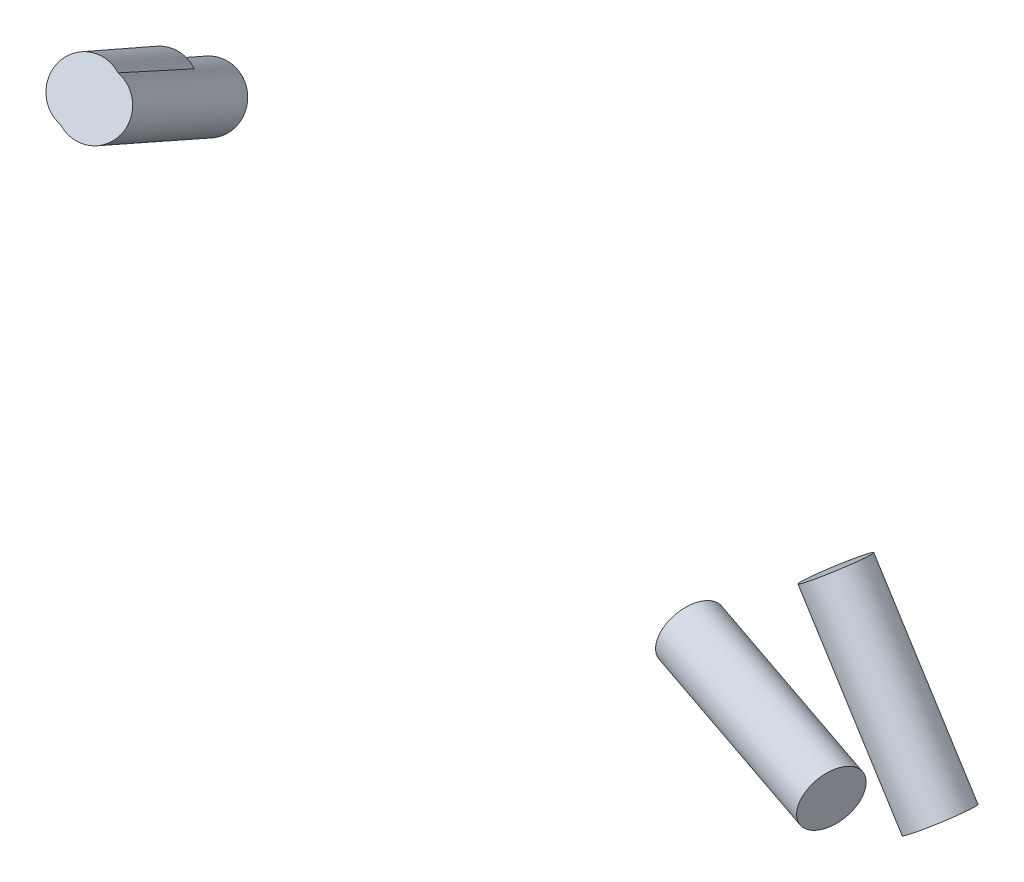
ISO-10303-21;
HEADER;
FILE_DESCRIPTION(('STEP AP214'),'2;1');
FILE_NAME('part.step','',(''),(''),'','','');
FILE_SCHEMA(('AUTOMOTIVE_DESIGN { 1 0 10303 214 1 1 1 1 }'));
ENDSEC;
DATA;
#1=APPLICATION_CONTEXT('core data for automotive mechanical design processes');
#2=APPLICATION_PROTOCOL_DEFINITION('international standard','automotive_design',2000,#1);
#3=PRODUCT_CONTEXT('',#1,'mechanical');
#4=PRODUCT('Part','Part','',(#3));
#5=PRODUCT_RELATED_PRODUCT_CATEGORY('part','',(#4));
#6=PRODUCT_DEFINITION_FORMATION('','',#4);
#7=PRODUCT_DEFINITION_CONTEXT('part definition',#1,'design');
#8=PRODUCT_DEFINITION('design','',#6,#7);
#9=PRODUCT_DEFINITION_SHAPE('','',#8);
#10=(LENGTH_UNIT() NAMED_UNIT(*) SI_UNIT(.MILLI.,.METRE.));
#11=(NAMED_UNIT(*) PLANE_ANGLE_UNIT() SI_UNIT($,.RADIAN.));
#12=(NAMED_UNIT(*) SI_UNIT($,.STERADIAN.) SOLID_ANGLE_UNIT());
#13=UNCERTAINTY_MEASURE_WITH_UNIT(LENGTH_MEASURE(1.E-05),#10,'distance_accuracy_value','');
#14=(GEOMETRIC_REPRESENTATION_CONTEXT(3) GLOBAL_UNCERTAINTY_ASSIGNED_CONTEXT((#13)) GLOBAL_UNIT_ASSIGNED_CONTEXT((#10,
#11,#12)) REPRESENTATION_CONTEXT('',''));
#15=CARTESIAN_POINT('',(0.,0.,0.));
#16=DIRECTION('',(0.,0.,1.));
#17=DIRECTION('',(1.,0.,0.));
#18=AXIS2_PLACEMENT_3D('',#15,#16,#17);
#19=CARTESIAN_POINT('',(90.2859184,-173.45527,-42.383));
#20=DIRECTION('',(-0.305548311077003,-0.520157791657343,-0.79754379276385));
#21=DIRECTION('',(0.,0.837600728553223,-0.546282911619163));
#22=AXIS2_PLACEMENT_3D('',#19,#20,#21);
#23=PLANE('',#22);
#24=CARTESIAN_POINT('',(90.2859184,-173.45527,-42.383));
#25=DIRECTION('',(-0.305548311077003,-0.520157791657343,-0.79754379276385));
#26=DIRECTION('',(0.,0.837600728553223,-0.546282911619163));
#27=AXIS2_PLACEMENT_3D('',#24,#25,#26);
#28=CIRCLE('',#27,7.00000000000001);
#29=CARTESIAN_POINT('',(88.6836040348085,-178.865647569836,-38.2404882948965));
#30=VERTEX_POINT('',#29);
#31=CARTESIAN_POINT('',(94.2313609407783,-169.421279764102,-46.5255120318586));
#32=VERTEX_POINT('',#31);
#33=EDGE_CURVE('E106',#30,#32,#28,.T.);
#34=ORIENTED_EDGE('',*,*,#33,.F.);
#35=CARTESIAN_POINT('',(92.6291910740161,-174.831742214472,-42.3830003267297));
#36=DIRECTION('',(-0.305548311077003,-0.520157791657343,-0.79754379276385));
#37=DIRECTION('',(-0.403946285206619,-0.687679794713225,0.603261053451115));
#38=AXIS2_PLACEMENT_3D('',#35,#36,#37);
#39=ELLIPSE('',#38,7.00003380497109,7.);
#40=EDGE_CURVE('E117',#30,#32,#39,.F.);
#41=ORIENTED_EDGE('',*,*,#40,.T.);
#42=EDGE_LOOP('',(#34,#41));
#43=FACE_BOUND('',#42,.T.);
#44=ADVANCED_FACE('F76',(#43),#23,.F.);
#45=CARTESIAN_POINT('',(79.0072944,-192.655717,-71.8225231));
#46=DIRECTION('',(-0.305548311077003,-0.520157791657343,-0.79754379276385));
#47=DIRECTION('',(0.,0.837600728553223,-0.546282911619163));
#48=AXIS2_PLACEMENT_3D('',#45,#46,#47);
#49=PLANE('',#48);
#50=CARTESIAN_POINT('',(81.3042270092609,-194.111078728709,-71.7533182940053));
#51=DIRECTION('',(-0.305548311077003,-0.520157791657343,-0.79754379276385));
#52=DIRECTION('',(-0.403946285206619,-0.687679794713225,0.603261053451115));
#53=AXIS2_PLACEMENT_3D('',#50,#51,#52);
#54=ELLIPSE('',#53,7.00003380497109,7.);
#55=CARTESIAN_POINT('',(77.1346731846192,-197.954491287071,-67.6492413172329));
#56=VERTEX_POINT('',#55);
#57=CARTESIAN_POINT('',(83.1767073308547,-188.812214646942,-75.9266046627928));
#58=VERTEX_POINT('',#57);
#59=EDGE_CURVE('E101',#56,#58,#54,.T.);
#60=ORIENTED_EDGE('',*,*,#59,.F.);
#61=CARTESIAN_POINT('',(79.0072944,-192.655717,-71.8225231));
#62=DIRECTION('',(-0.305548311077003,-0.520157791657343,-0.79754379276385));
#63=DIRECTION('',(0.,0.837600728553223,-0.546282911619163));
#64=AXIS2_PLACEMENT_3D('',#61,#62,#63);
#65=CIRCLE('',#64,7.00000000000001);
#66=EDGE_CURVE('E112',#56,#58,#65,.T.);
#67=ORIENTED_EDGE('',*,*,#66,.T.);
#68=EDGE_LOOP('',(#60,#67));
#69=FACE_BOUND('',#68,.T.);
#70=ADVANCED_FACE('F139',(#69),#49,.T.);
#71=CARTESIAN_POINT('',(90.2859184,-173.45527,-42.383));
#72=DIRECTION('',(-0.305548311077002,-0.520157791657342,-0.797543792763851));
#73=DIRECTION('',(0.,0.837600728553224,-0.546282911619162));
#74=AXIS2_PLACEMENT_3D('',#71,#72,#73);
#75=CYLINDRICAL_SURFACE('',#74,7.00000000000001);
#76=CARTESIAN_POINT('',(88.6836040348085,-178.865647569836,-38.2404882948965));
#77=CARTESIAN_POINT('',(87.2232316523993,-181.279398953401,-41.9578656735616));
#78=CARTESIAN_POINT('',(85.7629826047996,-183.692940530601,-45.6754277504005));
#79=CARTESIAN_POINT('',(81.9156006365208,-190.052062476592,-55.4716446048369));
#80=CARTESIAN_POINT('',(79.5286943233058,-193.99730544748,-61.5506074075355));
#81=CARTESIAN_POINT('',(77.1396930186936,-197.946193775641,-67.6364535677545));
#82=CARTESIAN_POINT('',(77.1371831014269,-197.950342531635,-67.642847442223));
#83=CARTESIAN_POINT('',(77.1346731846192,-197.954491287071,-67.6492413172329));
#84=B_SPLINE_CURVE_WITH_KNOTS('',3,(#76,#77,#78,#79,#80,#81,#82,#83),.UNSPECIFIED.,.F.,.F.,(4,2,
2,4),(0.,14.0000000298617,36.8898332261833,36.9139068928192),.UNSPECIFIED.);
#85=EDGE_CURVE('E13',#30,#56,#84,.T.);
#86=ORIENTED_EDGE('',*,*,#85,.F.);
#87=ORIENTED_EDGE('',*,*,#33,.T.);
#88=CARTESIAN_POINT('',(83.1767073308547,-188.812214646942,-75.9266046627928));
#89=CARTESIAN_POINT('',(84.5746206935149,-186.360292388074,-72.2101960093443));
#90=CARTESIAN_POINT('',(85.9723784962436,-183.908558923566,-68.4936042689251));
#91=CARTESIAN_POINT('',(89.6550583175193,-177.448820018056,-58.699993105567));
#92=CARTESIAN_POINT('',(91.939740660349,-173.4411436228,-52.6226665151017));
#93=CARTESIAN_POINT('',(94.2265162375328,-169.429778138715,-46.5384020009878));
#94=CARTESIAN_POINT('',(94.2289385893405,-169.425528951093,-46.5319570167003));
#95=CARTESIAN_POINT('',(94.2313609407783,-169.421279764102,-46.5255120318586));
#96=B_SPLINE_CURVE_WITH_KNOTS('',3,(#88,#89,#90,#91,#92,#93,#94,#95),.UNSPECIFIED.,.F.,.F.,(4,2,
2,4),(0.,14.000000029866,36.8896542032104,36.9139266331611),.UNSPECIFIED.);
#97=EDGE_CURVE('E89',#58,#32,#96,.T.);
#98=ORIENTED_EDGE('',*,*,#97,.F.);
#99=ORIENTED_EDGE('',*,*,#66,.F.);
#100=EDGE_LOOP('',(#86,#87,#98,#99));
#101=FACE_BOUND('',#100,.T.);
#102=ADVANCED_FACE('F108',(#101),#75,.T.);
#103=CARTESIAN_POINT('',(75.2253056000002,-204.459683,-87.5184769000008));
#104=DIRECTION('',(-0.30680222447323,-0.522292458953053,-0.79566511949378));
#105=DIRECTION('',(0.,0.835981770105138,-0.548757214122858));
#106=AXIS2_PLACEMENT_3D('',#103,#104,#105);
#107=PLANE('',#106);
#108=CARTESIAN_POINT('',(75.2253056000002,-204.459683,-87.5184769000008));
#109=DIRECTION('',(-0.30680222447323,-0.522292458953053,-0.79566511949378));
#110=DIRECTION('',(0.,0.835981770105138,-0.548757214122858));
#111=AXIS2_PLACEMENT_3D('',#108,#109,#110);
#112=CIRCLE('',#111,7.);
#113=CARTESIAN_POINT('',(75.2253056000002,-198.607810609264,-91.3597773988608));
#114=VERTEX_POINT('',#113);
#115=EDGE_CURVE('E118',#114,#114,#112,.T.);
#116=ORIENTED_EDGE('',*,*,#115,.T.);
#117=EDGE_LOOP('',(#116));
#118=FACE_BOUND('',#117,.T.);
#119=ADVANCED_FACE('F132',(#118),#107,.T.);
#120=CARTESIAN_POINT('',(94.1965818150663,-172.163455288949,-38.3181075658888));
#121=DIRECTION('',(-0.30680222447323,-0.522292458953052,-0.795665119493781));
#122=DIRECTION('',(0.,0.835981770105138,-0.548757214122858));
#123=AXIS2_PLACEMENT_3D('',#120,#121,#122);
#124=CYLINDRICAL_SURFACE('',#123,7.);
#125=ORIENTED_EDGE('',*,*,#40,.F.);
#126=ORIENTED_EDGE('',*,*,#85,.T.);
#127=ORIENTED_EDGE('',*,*,#59,.T.);
#128=ORIENTED_EDGE('',*,*,#97,.T.);
#129=EDGE_LOOP('',(#125,#126,#127,#128));
#130=FACE_BOUND('',#129,.T.);
#131=ORIENTED_EDGE('',*,*,#115,.F.);
#132=EDGE_LOOP('',(#131));
#133=FACE_BOUND('',#132,.T.);
#134=ADVANCED_FACE('F115',(#130,#133),#124,.T.);
#135=CLOSED_SHELL('',(#44,#70,#102,#119,#134));
#136=MANIFOLD_SOLID_BREP('B2',#135);
#137=CARTESIAN_POINT('',(217.671213,-235.931172,-96.1393535));
#138=DIRECTION('',(0.612437587886598,-0.787189398401177,0.0724779413921193));
#139=DIRECTION('',(0.789265153444726,0.614052536480286,0.));
#140=AXIS2_PLACEMENT_3D('',#137,#138,#139);
#141=PLANE('',#140);
#142=CARTESIAN_POINT('',(217.671213,-235.931172,-96.1393535));
#143=DIRECTION('',(0.612437587886598,-0.787189398401177,0.0724779413921193));
#144=DIRECTION('',(0.789265153444726,0.614052536480286,0.));
#145=AXIS2_PLACEMENT_3D('',#142,#143,#144);
#146=CIRCLE('',#145,7.);
#147=CARTESIAN_POINT('',(223.196069074113,-231.632804244638,-96.1393535));
#148=VERTEX_POINT('',#147);
#149=EDGE_CURVE('E211',#148,#148,#146,.T.);
#150=ORIENTED_EDGE('',*,*,#149,.F.);
#151=EDGE_LOOP('',(#150));
#152=FACE_BOUND('',#151,.T.);
#153=ADVANCED_FACE('F205',(#152),#141,.F.);
#154=CARTESIAN_POINT('',(246.179812,-272.574362,-92.7655492));
#155=DIRECTION('',(0.612437587886598,-0.787189398401177,0.0724779413921193));
#156=DIRECTION('',(0.789265153444726,0.614052536480286,0.));
#157=AXIS2_PLACEMENT_3D('',#154,#155,#156);
#158=PLANE('',#157);
#159=CARTESIAN_POINT('',(246.179812,-272.574362,-92.7655492));
#160=DIRECTION('',(0.612437587886598,-0.787189398401177,0.0724779413921193));
#161=DIRECTION('',(0.789265153444726,0.614052536480286,0.));
#162=AXIS2_PLACEMENT_3D('',#159,#160,#161);
#163=CIRCLE('',#162,7.);
#164=CARTESIAN_POINT('',(251.704668074113,-268.275994244638,-92.7655492));
#165=VERTEX_POINT('',#164);
#166=EDGE_CURVE('E75',#165,#165,#163,.T.);
#167=ORIENTED_EDGE('',*,*,#166,.T.);
#168=EDGE_LOOP('',(#167));
#169=FACE_BOUND('',#168,.T.);
#170=ADVANCED_FACE('F220',(#169),#158,.T.);
#171=CARTESIAN_POINT('',(217.671213,-235.931172,-96.1393535));
#172=DIRECTION('',(0.612437587886599,-0.787189398401176,0.0724779413921193));
#173=DIRECTION('',(0.789265153444725,0.614052536480288,0.));
#174=AXIS2_PLACEMENT_3D('',#171,#172,#173);
#175=CYLINDRICAL_SURFACE('',#174,7.);
#176=ORIENTED_EDGE('',*,*,#166,.F.);
#177=EDGE_LOOP('',(#176));
#178=FACE_BOUND('',#177,.T.);
#179=ORIENTED_EDGE('',*,*,#149,.T.);
#180=EDGE_LOOP('',(#179));
#181=FACE_BOUND('',#180,.T.);
#182=ADVANCED_FACE('F217',(#178,#181),#175,.T.);
#183=CLOSED_SHELL('',(#153,#170,#182));
#184=MANIFOLD_SOLID_BREP('B7',#183);
#185=CARTESIAN_POINT('',(210.980497,-238.523155,-67.7546604));
#186=DIRECTION('',(0.961206895835901,-0.178515476938392,0.210270130762719));
#187=DIRECTION('',(0.213702816900093,0.,-0.976898718419144));
#188=AXIS2_PLACEMENT_3D('',#185,#186,#187);
#189=PLANE('',#188);
#190=CARTESIAN_POINT('',(210.980497,-238.523155,-67.7546604));
#191=DIRECTION('',(0.961206895835901,-0.178515476938392,0.210270130762719));
#192=DIRECTION('',(0.213702816900093,0.,-0.976898718419144));
#193=AXIS2_PLACEMENT_3D('',#190,#191,#192);
#194=CIRCLE('',#193,6.99999999999999);
#195=CARTESIAN_POINT('',(212.476416718301,-238.523155,-74.592951428934));
#196=VERTEX_POINT('',#195);
#197=EDGE_CURVE('E264',#196,#196,#194,.T.);
#198=ORIENTED_EDGE('',*,*,#197,.F.);
#199=EDGE_LOOP('',(#198));
#200=FACE_BOUND('',#199,.T.);
#201=ADVANCED_FACE('F258',(#200),#189,.F.);
#202=CARTESIAN_POINT('',(254.500188,-246.605638,-58.2344508));
#203=DIRECTION('',(0.961206895835901,-0.178515476938392,0.210270130762719));
#204=DIRECTION('',(0.213702816900093,0.,-0.976898718419144));
#205=AXIS2_PLACEMENT_3D('',#202,#203,#204);
#206=PLANE('',#205);
#207=CARTESIAN_POINT('',(254.500188,-246.605638,-58.2344508));
#208=DIRECTION('',(0.961206895835901,-0.178515476938392,0.210270130762719));
#209=DIRECTION('',(0.213702816900093,0.,-0.976898718419144));
#210=AXIS2_PLACEMENT_3D('',#207,#208,#209);
#211=CIRCLE('',#210,6.99999999999999);
#212=CARTESIAN_POINT('',(255.996107718301,-246.605638,-65.072741828934));
#213=VERTEX_POINT('',#212);
#214=EDGE_CURVE('E204',#213,#213,#211,.T.);
#215=ORIENTED_EDGE('',*,*,#214,.T.);
#216=EDGE_LOOP('',(#215));
#217=FACE_BOUND('',#216,.T.);
#218=ADVANCED_FACE('F273',(#217),#206,.T.);
#219=CARTESIAN_POINT('',(210.980497,-238.523155,-67.7546604));
#220=DIRECTION('',(0.9612068958359,-0.178515476938392,0.210270130762719));
#221=DIRECTION('',(0.213702816900093,0.,-0.976898718419144));
#222=AXIS2_PLACEMENT_3D('',#219,#220,#221);
#223=CYLINDRICAL_SURFACE('',#222,6.99999999999999);
#224=ORIENTED_EDGE('',*,*,#214,.F.);
#225=EDGE_LOOP('',(#224));
#226=FACE_BOUND('',#225,.T.);
#227=ORIENTED_EDGE('',*,*,#197,.T.);
#228=EDGE_LOOP('',(#227));
#229=FACE_BOUND('',#228,.T.);
#230=ADVANCED_FACE('F270',(#226,#229),#223,.T.);
#231=CLOSED_SHELL('',(#201,#218,#230));
#232=MANIFOLD_SOLID_BREP('B70',#231);
#233=ADVANCED_BREP_SHAPE_REPRESENTATION('',(#18,#136,#184,#232),#14);
#234=SHAPE_DEFINITION_REPRESENTATION(#9,#233);
ENDSEC;
END-ISO-10303-21;
